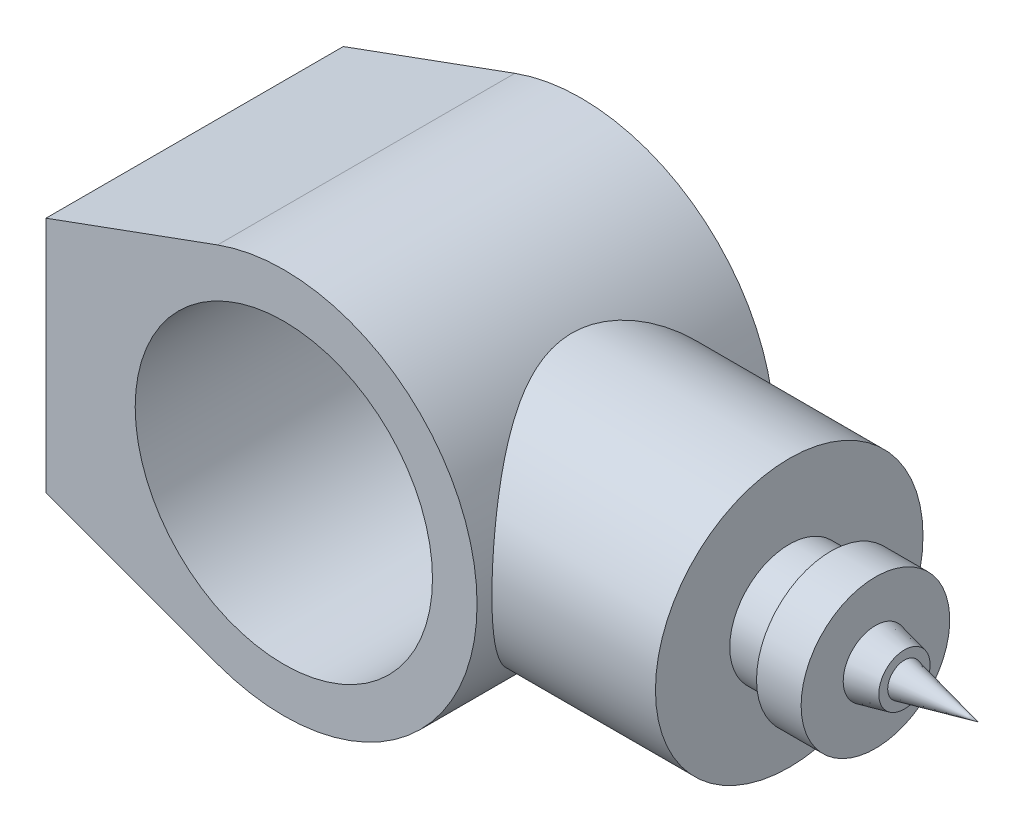
ISO-10303-21;
HEADER;
FILE_DESCRIPTION(('STEP AP214'),'2;1');
FILE_NAME('part.step','',(''),(''),'','','');
FILE_SCHEMA(('AUTOMOTIVE_DESIGN { 1 0 10303 214 1 1 1 1 }'));
ENDSEC;
DATA;
#1=APPLICATION_CONTEXT('core data for automotive mechanical design processes');
#2=APPLICATION_PROTOCOL_DEFINITION('international standard','automotive_design',2000,#1);
#3=PRODUCT_CONTEXT('',#1,'mechanical');
#4=PRODUCT('Part','Part','',(#3));
#5=PRODUCT_RELATED_PRODUCT_CATEGORY('part','',(#4));
#6=PRODUCT_DEFINITION_FORMATION('','',#4);
#7=PRODUCT_DEFINITION_CONTEXT('part definition',#1,'design');
#8=PRODUCT_DEFINITION('design','',#6,#7);
#9=PRODUCT_DEFINITION_SHAPE('','',#8);
#10=(LENGTH_UNIT() NAMED_UNIT(*) SI_UNIT(.MILLI.,.METRE.));
#11=(NAMED_UNIT(*) PLANE_ANGLE_UNIT() SI_UNIT($,.RADIAN.));
#12=(NAMED_UNIT(*) SI_UNIT($,.STERADIAN.) SOLID_ANGLE_UNIT());
#13=UNCERTAINTY_MEASURE_WITH_UNIT(LENGTH_MEASURE(1.E-05),#10,'distance_accuracy_value','');
#14=(GEOMETRIC_REPRESENTATION_CONTEXT(3) GLOBAL_UNCERTAINTY_ASSIGNED_CONTEXT((#13)) GLOBAL_UNIT_ASSIGNED_CONTEXT((#10,
#11,#12)) REPRESENTATION_CONTEXT('',''));
#15=CARTESIAN_POINT('',(0.,0.,0.));
#16=DIRECTION('',(0.,0.,1.));
#17=DIRECTION('',(1.,0.,0.));
#18=AXIS2_PLACEMENT_3D('',#15,#16,#17);
#19=CARTESIAN_POINT('',(0.,0.,50.));
#20=DIRECTION('',(0.,0.,1.));
#21=DIRECTION('',(1.,0.,0.));
#22=AXIS2_PLACEMENT_3D('',#19,#20,#21);
#23=PLANE('',#22);
#24=DIRECTION('',(0.939410286372225,-0.342794856813887,0.));
#25=VECTOR('',#24,1.);
#26=CARTESIAN_POINT('',(-80.,-40.,50.));
#27=LINE('',#26,#25);
#28=CARTESIAN_POINT('',(-80.,-40.,50.));
#29=VERTEX_POINT('',#28);
#30=CARTESIAN_POINT('',(-22.2816656929027,-61.0616686141946,50.));
#31=VERTEX_POINT('',#30);
#32=EDGE_CURVE('E190',#29,#31,#27,.T.);
#33=ORIENTED_EDGE('',*,*,#32,.T.);
#34=CARTESIAN_POINT('',(0.,0.,50.));
#35=DIRECTION('',(0.,0.,1.));
#36=DIRECTION('',(1.,0.,0.));
#37=AXIS2_PLACEMENT_3D('',#34,#35,#36);
#38=CIRCLE('',#37,65.);
#39=CARTESIAN_POINT('',(-22.2816656929027,61.0616686141947,50.));
#40=VERTEX_POINT('',#39);
#41=EDGE_CURVE('E91',#31,#40,#38,.T.);
#42=ORIENTED_EDGE('',*,*,#41,.T.);
#43=DIRECTION('',(-0.939410286372226,-0.342794856813887,0.));
#44=VECTOR('',#43,1.);
#45=CARTESIAN_POINT('',(-80.,40.,50.));
#46=LINE('',#45,#44);
#47=CARTESIAN_POINT('',(-80.,40.,50.));
#48=VERTEX_POINT('',#47);
#49=EDGE_CURVE('E186',#40,#48,#46,.T.);
#50=ORIENTED_EDGE('',*,*,#49,.T.);
#51=DIRECTION('',(0.,-1.,0.));
#52=VECTOR('',#51,1.);
#53=CARTESIAN_POINT('',(-80.,40.,50.));
#54=LINE('',#53,#52);
#55=EDGE_CURVE('E60',#48,#29,#54,.T.);
#56=ORIENTED_EDGE('',*,*,#55,.T.);
#57=EDGE_LOOP('',(#33,#42,#50,#56));
#58=FACE_BOUND('',#57,.T.);
#59=CARTESIAN_POINT('',(0.,0.,50.));
#60=DIRECTION('',(0.,0.,1.));
#61=DIRECTION('',(1.,0.,0.));
#62=AXIS2_PLACEMENT_3D('',#59,#60,#61);
#63=CIRCLE('',#62,50.);
#64=CARTESIAN_POINT('',(50.,0.,50.));
#65=VERTEX_POINT('',#64);
#66=EDGE_CURVE('E200',#65,#65,#63,.T.);
#67=ORIENTED_EDGE('',*,*,#66,.F.);
#68=EDGE_LOOP('',(#67));
#69=FACE_BOUND('',#68,.T.);
#70=ADVANCED_FACE('F43',(#58,#69),#23,.T.);
#71=CARTESIAN_POINT('',(0.,0.,-50.));
#72=DIRECTION('',(0.,0.,1.));
#73=DIRECTION('',(1.,0.,0.));
#74=AXIS2_PLACEMENT_3D('',#71,#72,#73);
#75=PLANE('',#74);
#76=DIRECTION('',(0.939410286372225,-0.342794856813887,0.));
#77=VECTOR('',#76,1.);
#78=CARTESIAN_POINT('',(-80.,-40.,-50.));
#79=LINE('',#78,#77);
#80=CARTESIAN_POINT('',(-80.,-40.,-50.));
#81=VERTEX_POINT('',#80);
#82=CARTESIAN_POINT('',(-22.2816656929027,-61.0616686141946,-50.));
#83=VERTEX_POINT('',#82);
#84=EDGE_CURVE('E184',#81,#83,#79,.T.);
#85=ORIENTED_EDGE('',*,*,#84,.F.);
#86=DIRECTION('',(0.,-1.,0.));
#87=VECTOR('',#86,1.);
#88=CARTESIAN_POINT('',(-80.,40.,-50.));
#89=LINE('',#88,#87);
#90=CARTESIAN_POINT('',(-80.,40.,-50.));
#91=VERTEX_POINT('',#90);
#92=EDGE_CURVE('E84',#91,#81,#89,.T.);
#93=ORIENTED_EDGE('',*,*,#92,.F.);
#94=DIRECTION('',(-0.939410286372226,-0.342794856813887,0.));
#95=VECTOR('',#94,1.);
#96=CARTESIAN_POINT('',(-80.,40.,-50.));
#97=LINE('',#96,#95);
#98=CARTESIAN_POINT('',(-22.2816656929027,61.0616686141947,-50.));
#99=VERTEX_POINT('',#98);
#100=EDGE_CURVE('E78',#99,#91,#97,.T.);
#101=ORIENTED_EDGE('',*,*,#100,.F.);
#102=CARTESIAN_POINT('',(0.,0.,-50.));
#103=DIRECTION('',(0.,0.,1.));
#104=DIRECTION('',(1.,0.,0.));
#105=AXIS2_PLACEMENT_3D('',#102,#103,#104);
#106=CIRCLE('',#105,65.);
#107=EDGE_CURVE('E179',#83,#99,#106,.T.);
#108=ORIENTED_EDGE('',*,*,#107,.F.);
#109=EDGE_LOOP('',(#85,#93,#101,#108));
#110=FACE_BOUND('',#109,.T.);
#111=CARTESIAN_POINT('',(0.,0.,-50.));
#112=DIRECTION('',(0.,0.,1.));
#113=DIRECTION('',(1.,0.,0.));
#114=AXIS2_PLACEMENT_3D('',#111,#112,#113);
#115=CIRCLE('',#114,50.);
#116=CARTESIAN_POINT('',(50.,0.,-50.));
#117=VERTEX_POINT('',#116);
#118=EDGE_CURVE('E202',#117,#117,#115,.T.);
#119=ORIENTED_EDGE('',*,*,#118,.T.);
#120=EDGE_LOOP('',(#119));
#121=FACE_BOUND('',#120,.T.);
#122=ADVANCED_FACE('F158',(#110,#121),#75,.F.);
#123=CARTESIAN_POINT('',(-80.,-40.,50.));
#124=DIRECTION('',(0.342794856813887,0.939410286372225,0.));
#125=DIRECTION('',(-0.939410286372225,0.342794856813887,0.));
#126=AXIS2_PLACEMENT_3D('',#123,#124,#125);
#127=PLANE('',#126);
#128=ORIENTED_EDGE('',*,*,#84,.T.);
#129=DIRECTION('',(0.,0.,-1.));
#130=VECTOR('',#129,1.);
#131=CARTESIAN_POINT('',(-22.2816656929027,-61.0616686141946,50.));
#132=LINE('',#131,#130);
#133=EDGE_CURVE('E11',#31,#83,#132,.T.);
#134=ORIENTED_EDGE('',*,*,#133,.F.);
#135=ORIENTED_EDGE('',*,*,#32,.F.);
#136=DIRECTION('',(0.,0.,-1.));
#137=VECTOR('',#136,1.);
#138=CARTESIAN_POINT('',(-80.,-40.,50.));
#139=LINE('',#138,#137);
#140=EDGE_CURVE('E194',#29,#81,#139,.T.);
#141=ORIENTED_EDGE('',*,*,#140,.T.);
#142=EDGE_LOOP('',(#128,#134,#135,#141));
#143=FACE_BOUND('',#142,.T.);
#144=ADVANCED_FACE('F45',(#143),#127,.F.);
#145=CARTESIAN_POINT('',(0.,0.,50.));
#146=DIRECTION('',(0.,0.,-1.));
#147=DIRECTION('',(-1.,0.,0.));
#148=AXIS2_PLACEMENT_3D('',#145,#146,#147);
#149=CYLINDRICAL_SURFACE('',#148,65.);
#150=CARTESIAN_POINT('',(65.,0.,-45.));
#151=CARTESIAN_POINT('',(65.0000011696057,1.12147330120565,-45.0000012025283));
#152=CARTESIAN_POINT('',(64.9709159765212,2.24292945230778,-44.9580201602482));
#153=CARTESIAN_POINT('',(64.8553068641383,4.47658414079082,-44.7907856093689));
#154=CARTESIAN_POINT('',(64.7687842573088,5.58878288911931,-44.6655340035371));
#155=CARTESIAN_POINT('',(64.5403785763002,7.79555151848627,-44.3336771879691));
#156=CARTESIAN_POINT('',(64.3984760503456,8.8901150644775,-44.1270433931238));
#157=CARTESIAN_POINT('',(64.0626457436966,11.0533096019768,-43.6354760134034));
#158=CARTESIAN_POINT('',(63.8687169569864,12.1219400915896,-43.3505409144375));
#159=CARTESIAN_POINT('',(63.4342222744662,14.2212125160505,-42.7078017297046));
#160=CARTESIAN_POINT('',(63.1938918545645,15.2520162370063,-42.3503651251477));
#161=CARTESIAN_POINT('',(62.6709259446924,17.2756280115286,-41.5659763086892));
#162=CARTESIAN_POINT('',(62.3882907364915,18.2684363181069,-41.1390245597888));
#163=CARTESIAN_POINT('',(61.786108553932,20.2116697228795,-40.2199419970838));
#164=CARTESIAN_POINT('',(61.4665619062631,21.1620951960855,-39.7278117601444));
#165=CARTESIAN_POINT('',(60.7962171584065,23.0172309124314,-38.6825647509799));
#166=CARTESIAN_POINT('',(60.4454175300334,23.9219389167185,-38.1294449962195));
#167=CARTESIAN_POINT('',(59.6865648974474,25.7601880140228,-36.9151737617935));
#168=CARTESIAN_POINT('',(59.27618815402,26.6893215363403,-36.2488040005491));
#169=CARTESIAN_POINT('',(58.4330275057249,28.4880338622967,-34.8529502059224));
#170=CARTESIAN_POINT('',(58.0002425478181,29.3576098626539,-34.1234632053608));
#171=CARTESIAN_POINT('',(57.1195111836478,31.0364486388512,-32.6040251352403));
#172=CARTESIAN_POINT('',(56.6715447181891,31.8456267033451,-31.8139921794123));
#173=CARTESIAN_POINT('',(55.7691986061138,33.4006700551814,-30.1773036556993));
#174=CARTESIAN_POINT('',(55.3148185876119,34.1465316534289,-29.3306447936721));
#175=CARTESIAN_POINT('',(54.3303114345595,35.6959084068904,-27.4326466159468));
#176=CARTESIAN_POINT('',(53.8005937511269,36.4872853280241,-26.3711450656527));
#177=CARTESIAN_POINT('',(52.7593327891933,37.977350950991,-24.17604025639));
#178=CARTESIAN_POINT('',(52.2477941160227,38.6760162868262,-23.0424189272517));
#179=CARTESIAN_POINT('',(51.2608149265043,39.9749077721744,-20.7072341856928));
#180=CARTESIAN_POINT('',(50.7853275075273,40.5752630453964,-19.5057627267967));
#181=CARTESIAN_POINT('',(49.8892399163793,41.6721166930025,-17.036931864064));
#182=CARTESIAN_POINT('',(49.4686114171659,42.1686687478853,-15.7696069409943));
#183=CARTESIAN_POINT('',(48.8208029416879,42.9149535309564,-13.5723996352816));
#184=CARTESIAN_POINT('',(48.5738420263558,43.1936925213245,-12.6581208440976));
#185=CARTESIAN_POINT('',(48.1238801744123,43.6944569649788,-10.8035389223551));
#186=CARTESIAN_POINT('',(47.9208721021929,43.9164916250901,-9.86324004407419));
#187=CARTESIAN_POINT('',(47.5660754926548,44.3005296261304,-7.96250438663408));
#188=CARTESIAN_POINT('',(47.4142038087044,44.4626304606427,-7.00210302149487));
#189=CARTESIAN_POINT('',(47.1671263845177,44.7246555122386,-5.06554052628517));
#190=CARTESIAN_POINT('',(47.071920625953,44.824579749433,-4.08937940131224));
#191=CARTESIAN_POINT('',(46.9418899090943,44.9607388198673,-2.12323648479671));
#192=CARTESIAN_POINT('',(46.9073939345417,44.9966266570423,-1.13320851844658));
#193=CARTESIAN_POINT('',(46.9013571135476,45.0029190462421,0.847248377093846));
#194=CARTESIAN_POINT('',(46.9298161498631,44.9733237202183,1.83767730553399));
#195=CARTESIAN_POINT('',(47.0484302849821,44.8492190899201,3.81128752429081));
#196=CARTESIAN_POINT('',(47.1386230552101,44.7546701492421,4.79446401850661));
#197=CARTESIAN_POINT('',(47.3768313176079,44.5024241630868,6.74551496467456));
#198=CARTESIAN_POINT('',(47.5248480621437,44.3447257499009,7.71338908473168));
#199=CARTESIAN_POINT('',(47.8621764271841,43.9803320764262,9.56919366964685));
#200=CARTESIAN_POINT('',(48.0484149088864,43.7772163066585,10.4583970625519));
#201=CARTESIAN_POINT('',(48.4609441046406,43.3201064011899,12.2144143492181));
#202=CARTESIAN_POINT('',(48.6872496045115,43.0660934784814,13.0812198417583));
#203=CARTESIAN_POINT('',(49.1738509640383,42.5096331932464,14.7898225666927));
#204=CARTESIAN_POINT('',(49.4341648638834,42.2071601049958,15.6316062329481));
#205=CARTESIAN_POINT('',(49.9825182796335,41.5563350032134,17.2876417419013));
#206=CARTESIAN_POINT('',(50.2705534011697,41.2079902580444,18.1018979206949));
#207=CARTESIAN_POINT('',(51.0225431471345,40.2767822129268,20.1137766396802));
#208=CARTESIAN_POINT('',(51.5007434523329,39.6654891440572,21.2930273345177));
#209=CARTESIAN_POINT('',(52.4891158781477,38.348029920852,23.5833678403921));
#210=CARTESIAN_POINT('',(52.9993005340589,37.6418264436726,24.6944305853524));
#211=CARTESIAN_POINT('',(54.0361557973494,36.1376496350166,26.8476775780095));
#212=CARTESIAN_POINT('',(54.5628535785461,35.3395185623559,27.8897384505711));
#213=CARTESIAN_POINT('',(55.6171804467178,33.6558443419671,29.8998791095632));
#214=CARTESIAN_POINT('',(56.1448094104418,32.7703120184234,30.8679680307498));
#215=CARTESIAN_POINT('',(57.1932449701135,30.9045304086319,32.7363921475659));
#216=CARTESIAN_POINT('',(57.7139191350983,29.9233731295192,33.6358963165067));
#217=CARTESIAN_POINT('',(58.7296419536465,27.8771206485979,35.3503553497921));
#218=CARTESIAN_POINT('',(59.2246882700661,26.8120178135979,36.1653025097018));
#219=CARTESIAN_POINT('',(60.1756566955639,24.603520952242,37.7024332048813));
#220=CARTESIAN_POINT('',(60.6316475651595,23.4602711709794,38.4247809320632));
#221=CARTESIAN_POINT('',(61.4931891608211,21.0989507187335,39.7703323765769));
#222=CARTESIAN_POINT('',(61.898755017873,19.8809026570888,40.3935658507715));
#223=CARTESIAN_POINT('',(62.5646802947783,17.6549035875762,41.4059204565395));
#224=CARTESIAN_POINT('',(62.8372982548467,16.6602403417733,41.8163120535009));
#225=CARTESIAN_POINT('',(63.3397164077328,14.6345031625144,42.5675669112335));
#226=CARTESIAN_POINT('',(63.569522535998,13.603434299959,42.9084398107234));
#227=CARTESIAN_POINT('',(63.9815049902596,11.5110112910016,43.5164676119118));
#228=CARTESIAN_POINT('',(64.1637052650743,10.4496726714621,43.7836595836378));
#229=CARTESIAN_POINT('',(64.476639865795,8.3029699318337,44.2409869387356));
#230=CARTESIAN_POINT('',(64.6073730982257,7.21760530180253,44.431120684921));
#231=CARTESIAN_POINT('',(64.8147345736682,5.02649787175021,44.7321113931982));
#232=CARTESIAN_POINT('',(64.8911534961694,3.9206929048976,44.8426616714377));
#233=CARTESIAN_POINT('',(64.9872183357685,1.70145350776205,44.9815637341559));
#234=CARTESIAN_POINT('',(65.0068642771874,0.588019080747661,45.0099155538474));
#235=CARTESIAN_POINT('',(64.9889001241945,-1.63741781931569,44.9839662509348));
#236=CARTESIAN_POINT('',(64.9512898349751,-2.7494202874797,44.929664847113));
#237=CARTESIAN_POINT('',(64.819734418053,-4.96298947367604,44.7392747901951));
#238=CARTESIAN_POINT('',(64.7257910494465,-6.06455651648128,44.6031886909653));
#239=CARTESIAN_POINT('',(64.491175703309,-8.18254449212149,44.2620157992034));
#240=CARTESIAN_POINT('',(64.3536808680178,-9.20007959997774,44.0616107864454));
#241=CARTESIAN_POINT('',(64.0337856060908,-11.2121337136589,43.5930613516679));
#242=CARTESIAN_POINT('',(63.8513873855499,-12.2066538475799,43.3249202574929));
#243=CARTESIAN_POINT('',(63.4451725249075,-14.1673074608523,42.7239854011605));
#244=CARTESIAN_POINT('',(63.2213525684632,-15.1334386601222,42.3911864622047));
#245=CARTESIAN_POINT('',(62.736336352677,-17.0327019487273,41.6643868113868));
#246=CARTESIAN_POINT('',(62.4751380044848,-17.965832190203,41.2703826790342));
#247=CARTESIAN_POINT('',(61.8990085085122,-19.8637431772395,40.3931275129008));
#248=CARTESIAN_POINT('',(61.5815209528501,-20.8256806929253,39.9054081529013));
#249=CARTESIAN_POINT('',(60.9142086391395,-22.7035764997345,38.8677076181211));
#250=CARTESIAN_POINT('',(60.5643826081083,-23.6195329786528,38.3177239921568));
#251=CARTESIAN_POINT('',(59.8381347129401,-25.4032558353403,37.1592008079418));
#252=CARTESIAN_POINT('',(59.4616987975441,-26.270996314329,36.5506302507532));
#253=CARTESIAN_POINT('',(58.6884577670336,-27.9557544991496,35.2787474176624));
#254=CARTESIAN_POINT('',(58.2916515549571,-28.7727694681138,34.6154321925309));
#255=CARTESIAN_POINT('',(57.4151711853793,-30.4889708749912,33.1199200847161));
#256=CARTESIAN_POINT('',(56.9328754552547,-31.3785212006928,32.2781812569548));
#257=CARTESIAN_POINT('',(55.9590893109094,-33.083904221517,30.5278352445589));
#258=CARTESIAN_POINT('',(55.4675975421249,-33.8997259516808,29.6192181500899));
#259=CARTESIAN_POINT('',(54.4860350387396,-35.45586994741,27.7375714933992));
#260=CARTESIAN_POINT('',(53.9959654596117,-36.1961418986443,26.7644997080006));
#261=CARTESIAN_POINT('',(53.0294834997435,-37.5978502361012,24.7568233036381));
#262=CARTESIAN_POINT('',(52.553069328415,-38.2592969946585,23.7222268074148));
#263=CARTESIAN_POINT('',(51.679941347726,-39.4291013564639,21.7149007388746));
#264=CARTESIAN_POINT('',(51.2803372484816,-39.9463152685162,20.7485884228094));
#265=CARTESIAN_POINT('',(50.5123974548912,-40.9130636661729,18.7705314851885));
#266=CARTESIAN_POINT('',(50.1440619804653,-41.3625976757847,17.7587865441704));
#267=CARTESIAN_POINT('',(49.4504928922364,-42.1893301292689,15.693797265063));
#268=CARTESIAN_POINT('',(49.1251906412473,-42.566644202947,14.6406225749502));
#269=CARTESIAN_POINT('',(48.5290098021012,-43.2451098617227,12.4950157035288));
#270=CARTESIAN_POINT('',(48.2581179989952,-43.5462799449171,11.4025931307277));
#271=CARTESIAN_POINT('',(47.8271610412375,-44.018687486118,9.3921629994351));
#272=CARTESIAN_POINT('',(47.6558419905218,-44.2036946073207,8.47979353570418));
#273=CARTESIAN_POINT('',(47.3627606953031,-44.517583244497,6.63757582668244));
#274=CARTESIAN_POINT('',(47.2409923142224,-44.6464717105955,5.70772976070372));
#275=CARTESIAN_POINT('',(47.05166615705,-44.8459556683364,3.83718735816971));
#276=CARTESIAN_POINT('',(46.9840561376509,-44.9166073394187,2.89650236820513));
#277=CARTESIAN_POINT('',(46.9055698265682,-44.9985645522097,1.01014116515034));
#278=CARTESIAN_POINT('',(46.8946943314281,-45.0098692606967,0.0644648821697781));
#279=CARTESIAN_POINT('',(46.9301408777119,-44.972908524549,-1.82506201386805));
#280=CARTESIAN_POINT('',(46.9764888551696,-44.9246160680299,-2.76891160474202));
#281=CARTESIAN_POINT('',(47.1245232303033,-44.7693052695385,-4.64731891289863));
#282=CARTESIAN_POINT('',(47.226209296244,-44.6622872796082,-5.58187668584875));
#283=CARTESIAN_POINT('',(47.4811423262629,-44.3911660407895,-7.43666598606562));
#284=CARTESIAN_POINT('',(47.634452919394,-44.2269923369625,-8.35687836049679));
#285=CARTESIAN_POINT('',(47.9871889035598,-43.8440109221367,-10.1768310643423));
#286=CARTESIAN_POINT('',(48.1866204648689,-43.6251959006593,-11.0765686368372));
#287=CARTESIAN_POINT('',(48.6908782922366,-43.0625185245671,-13.116726178063));
#288=CARTESIAN_POINT('',(49.0093972350599,-42.7008255731353,-14.2488681052183));
#289=CARTESIAN_POINT('',(49.699554494161,-41.8955268796886,-16.4668795226373));
#290=CARTESIAN_POINT('',(50.0712093704162,-41.4518955887103,-17.5527344499461));
#291=CARTESIAN_POINT('',(50.8544123719762,-40.4872212981013,-19.6760329984318));
#292=CARTESIAN_POINT('',(51.2660067549033,-39.9660881554129,-20.7134183727638));
#293=CARTESIAN_POINT('',(52.116211879306,-38.8508952329155,-22.7363587217865));
#294=CARTESIAN_POINT('',(52.5548209260535,-38.2568400254561,-23.7219169406072));
#295=CARTESIAN_POINT('',(53.4579357785502,-36.9847423381263,-25.6613286822633));
#296=CARTESIAN_POINT('',(53.9228021101372,-36.305111863905,-26.6139712103077));
#297=CARTESIAN_POINT('',(54.8583333343946,-34.8753950985048,-28.4617532840731));
#298=CARTESIAN_POINT('',(55.3289982185488,-34.1253089107936,-29.3568929142368));
#299=CARTESIAN_POINT('',(56.2664339133503,-32.5564691651912,-31.0876310121466));
#300=CARTESIAN_POINT('',(56.733203509343,-31.7376950080829,-31.923211478402));
#301=CARTESIAN_POINT('',(57.6535165855435,-30.033481652025,-33.5315189390535));
#302=CARTESIAN_POINT('',(58.1070588196762,-29.1480362003111,-34.3042400240121));
#303=CARTESIAN_POINT('',(59.0635284336244,-27.1643113596245,-35.9022819462667));
#304=CARTESIAN_POINT('',(59.5626106290919,-26.0547472869609,-36.7159606163356));
#305=CARTESIAN_POINT('',(60.5176757229357,-23.7521280348397,-38.2458641369291));
#306=CARTESIAN_POINT('',(60.9736519283074,-22.5590599397197,-38.962073861155));
#307=CARTESIAN_POINT('',(61.6149926579414,-20.712734812731,-39.9558623322098));
#308=CARTESIAN_POINT('',(61.8215919655179,-20.088110583999,-40.2735888165198));
#309=CARTESIAN_POINT('',(62.2191547005857,-18.8206694867556,-40.8812436548858));
#310=CARTESIAN_POINT('',(62.4101203779566,-18.1778552539996,-41.1711760099034));
#311=CARTESIAN_POINT('',(62.7748527233683,-16.8752831176649,-41.7219931318356));
#312=CARTESIAN_POINT('',(62.9486230408552,-16.2155288469421,-41.9828840638124));
#313=CARTESIAN_POINT('',(63.2775356475737,-14.8804011558233,-42.4744610119283));
#314=CARTESIAN_POINT('',(63.432679284421,-14.2050288695917,-42.7051492133046));
#315=CARTESIAN_POINT('',(63.8070721968101,-12.4447010544915,-43.25974494481));
#316=CARTESIAN_POINT('',(64.0114184468014,-11.3490405228654,-43.5602757498286));
#317=CARTESIAN_POINT('',(64.3654191982087,-9.12991345978799,-44.078827644396));
#318=CARTESIAN_POINT('',(64.5150820049425,-8.00645117856253,-44.2968612637911));
#319=CARTESIAN_POINT('',(64.7559993187061,-5.7408225372911,-44.6470112993715));
#320=CARTESIAN_POINT('',(64.847297757104,-4.59867091062171,-44.7791923387442));
#321=CARTESIAN_POINT('',(64.9692976296881,-2.30434018473195,-44.9556862638234));
#322=CARTESIAN_POINT('',(64.9999987983895,-1.15216104160189,-44.999998764566));
#323=CARTESIAN_POINT('',(65.,0.,-45.));
#324=B_SPLINE_CURVE_WITH_KNOTS('',3,(#150,#151,#152,#153,#154,#155,#156,#157,#158,#159,#160,
#161,#162,#163,#164,#165,#166,#167,#168,#169,#170,#171,#172,#173,#174,#175,#176,#177,#178,#179,
#180,#181,#182,#183,#184,#185,#186,#187,#188,#189,#190,#191,#192,#193,#194,#195,#196,#197,#198,
#199,#200,#201,#202,#203,#204,#205,#206,#207,#208,#209,#210,#211,#212,#213,#214,#215,#216,#217,
#218,#219,#220,#221,#222,#223,#224,#225,#226,#227,#228,#229,#230,#231,#232,#233,#234,#235,#236,
#237,#238,#239,#240,#241,#242,#243,#244,#245,#246,#247,#248,#249,#250,#251,#252,#253,#254,#255,
#256,#257,#258,#259,#260,#261,#262,#263,#264,#265,#266,#267,#268,#269,#270,#271,#272,#273,#274,
#275,#276,#277,#278,#279,#280,#281,#282,#283,#284,#285,#286,#287,#288,#289,#290,#291,#292,#293,
#294,#295,#296,#297,#298,#299,#300,#301,#302,#303,#304,#305,#306,#307,#308,#309,#310,#311,#312,
#313,#314,#315,#316,#317,#318,#319,#320,#321,#322,#323),.UNSPECIFIED.,.T.,.F.,(4,2,2,2,2,2,2,2,
2,2,2,2,2,2,2,2,2,2,2,2,2,2,2,2,2,2,2,2,2,2,2,2,2,2,2,2,2,2,2,2,2,2,2,2,2,2,2,2,2,2,2,2,2,2,2,2,
2,2,2,2,2,2,2,2,2,2,2,2,2,2,2,2,2,2,2,2,2,2,2,2,2,2,2,2,2,2,4),(0.,3.36323892794144,
6.72640100710136,10.0907454360665,13.4551549250109,16.8029195613731,20.1506619010729,
23.4983746134034,26.8462511096753,30.4871649037346,34.1282499524345,37.7743494260164,
41.4206611917408,45.6939383064405,49.9682903731881,54.2369825353392,58.5034617073671,
61.4625138492405,64.4210852373372,67.3748225577202,70.3285589227264,73.2982527376573,
76.2679410220408,79.2394430998938,82.2110095388412,85.0011411726389,87.7923045951579,
90.584954683776,93.3771628083065,97.6064034875676,101.837312178738,106.075592113262,
110.313347816192,114.596218662803,118.879479402292,123.155037051935,127.429308626693,
130.755998382163,134.082226580387,137.406778235214,140.731400520075,144.068767009318,
147.406132068879,150.743508483461,154.080780688207,157.215791533369,160.350648386749,
163.485756334407,166.621039552604,169.990545063149,173.360183268584,176.73161428665,
180.103227050672,184.047902440152,187.993163521895,191.94103513809,195.888386692538,
199.385185586645,202.88200907258,206.373186157811,209.863514294626,212.700365177753,
215.536864625513,218.370624567028,221.204424293963,224.039508887241,226.874576485218,
229.713151272815,232.55210603787,236.23803941247,239.925124033801,243.616531168718,
247.307706963636,251.081871120678,254.856029735251,258.631324277359,262.406973327354,
266.792058434818,271.177823293658,273.368885604935,275.55963203795,277.749912517597,
279.940034437727,283.398420446896,286.856280978073,290.31153567335,293.766805506531),.UNSPECIFIED.);
#325=CARTESIAN_POINT('',(65.,0.,-45.));
#326=VERTEX_POINT('',#325);
#327=EDGE_CURVE('E124',#326,#326,#324,.T.);
#328=ORIENTED_EDGE('',*,*,#327,.F.);
#329=EDGE_LOOP('',(#328));
#330=FACE_BOUND('',#329,.T.);
#331=ORIENTED_EDGE('',*,*,#107,.T.);
#332=DIRECTION('',(0.,0.,-1.));
#333=VECTOR('',#332,1.);
#334=CARTESIAN_POINT('',(-22.2816656929027,61.0616686141947,50.));
#335=LINE('',#334,#333);
#336=EDGE_CURVE('E52',#40,#99,#335,.T.);
#337=ORIENTED_EDGE('',*,*,#336,.F.);
#338=ORIENTED_EDGE('',*,*,#41,.F.);
#339=ORIENTED_EDGE('',*,*,#133,.T.);
#340=EDGE_LOOP('',(#331,#337,#338,#339));
#341=FACE_BOUND('',#340,.T.);
#342=ADVANCED_FACE('F171',(#330,#341),#149,.T.);
#343=CARTESIAN_POINT('',(-80.,40.,50.));
#344=DIRECTION('',(0.342794856813887,-0.939410286372225,0.));
#345=DIRECTION('',(0.939410286372225,0.342794856813887,0.));
#346=AXIS2_PLACEMENT_3D('',#343,#344,#345);
#347=PLANE('',#346);
#348=ORIENTED_EDGE('',*,*,#100,.T.);
#349=DIRECTION('',(0.,0.,-1.));
#350=VECTOR('',#349,1.);
#351=CARTESIAN_POINT('',(-80.,40.,50.));
#352=LINE('',#351,#350);
#353=EDGE_CURVE('E187',#48,#91,#352,.T.);
#354=ORIENTED_EDGE('',*,*,#353,.F.);
#355=ORIENTED_EDGE('',*,*,#49,.F.);
#356=ORIENTED_EDGE('',*,*,#336,.T.);
#357=EDGE_LOOP('',(#348,#354,#355,#356));
#358=FACE_BOUND('',#357,.T.);
#359=ADVANCED_FACE('F169',(#358),#347,.F.);
#360=CARTESIAN_POINT('',(-80.,40.,50.));
#361=DIRECTION('',(1.,0.,0.));
#362=DIRECTION('',(0.,1.,0.));
#363=AXIS2_PLACEMENT_3D('',#360,#361,#362);
#364=PLANE('',#363);
#365=ORIENTED_EDGE('',*,*,#92,.T.);
#366=ORIENTED_EDGE('',*,*,#140,.F.);
#367=ORIENTED_EDGE('',*,*,#55,.F.);
#368=ORIENTED_EDGE('',*,*,#353,.T.);
#369=EDGE_LOOP('',(#365,#366,#367,#368));
#370=FACE_BOUND('',#369,.T.);
#371=ADVANCED_FACE('F155',(#370),#364,.F.);
#372=CARTESIAN_POINT('',(0.,0.,50.));
#373=DIRECTION('',(0.,0.,-1.));
#374=DIRECTION('',(-1.,0.,0.));
#375=AXIS2_PLACEMENT_3D('',#372,#373,#374);
#376=CYLINDRICAL_SURFACE('',#375,50.);
#377=ORIENTED_EDGE('',*,*,#66,.T.);
#378=EDGE_LOOP('',(#377));
#379=FACE_BOUND('',#378,.T.);
#380=ORIENTED_EDGE('',*,*,#118,.F.);
#381=EDGE_LOOP('',(#380));
#382=FACE_BOUND('',#381,.T.);
#383=ADVANCED_FACE('F145',(#379,#382),#376,.F.);
#384=CARTESIAN_POINT('',(-80.002,0.,0.));
#385=DIRECTION('',(1.,0.,0.));
#386=DIRECTION('',(0.,0.,-1.));
#387=AXIS2_PLACEMENT_3D('',#384,#385,#386);
#388=CYLINDRICAL_SURFACE('',#387,45.);
#389=CARTESIAN_POINT('',(120.,0.,0.));
#390=DIRECTION('',(1.,0.,0.));
#391=DIRECTION('',(0.,0.,-1.));
#392=AXIS2_PLACEMENT_3D('',#389,#390,#391);
#393=CIRCLE('',#392,45.);
#394=CARTESIAN_POINT('',(120.,0.,-45.));
#395=VERTEX_POINT('',#394);
#396=EDGE_CURVE('E132',#395,#395,#393,.T.);
#397=ORIENTED_EDGE('',*,*,#396,.F.);
#398=EDGE_LOOP('',(#397));
#399=FACE_BOUND('',#398,.T.);
#400=ORIENTED_EDGE('',*,*,#327,.T.);
#401=EDGE_LOOP('',(#400));
#402=FACE_BOUND('',#401,.T.);
#403=ADVANCED_FACE('F134',(#399,#402),#388,.T.);
#404=CARTESIAN_POINT('',(120.,0.,0.));
#405=DIRECTION('',(1.,0.,0.));
#406=DIRECTION('',(0.,0.,-1.));
#407=AXIS2_PLACEMENT_3D('',#404,#405,#406);
#408=PLANE('',#407);
#409=CARTESIAN_POINT('',(120.,0.,0.));
#410=DIRECTION('',(-1.,0.,0.));
#411=DIRECTION('',(0.,0.,1.));
#412=AXIS2_PLACEMENT_3D('',#409,#410,#411);
#413=CIRCLE('',#412,20.);
#414=CARTESIAN_POINT('',(120.,0.,20.));
#415=VERTEX_POINT('',#414);
#416=EDGE_CURVE('E121',#415,#415,#413,.T.);
#417=ORIENTED_EDGE('',*,*,#416,.T.);
#418=EDGE_LOOP('',(#417));
#419=FACE_BOUND('',#418,.T.);
#420=ORIENTED_EDGE('',*,*,#396,.T.);
#421=EDGE_LOOP('',(#420));
#422=FACE_BOUND('',#421,.T.);
#423=ADVANCED_FACE('F142',(#419,#422),#408,.T.);
#424=CARTESIAN_POINT('',(0.,0.,0.));
#425=DIRECTION('',(-1.,0.,0.));
#426=DIRECTION('',(0.,0.,1.));
#427=AXIS2_PLACEMENT_3D('',#424,#425,#426);
#428=CYLINDRICAL_SURFACE('',#427,20.);
#429=CARTESIAN_POINT('',(134.,0.,0.));
#430=DIRECTION('',(-1.,0.,0.));
#431=DIRECTION('',(0.,0.,1.));
#432=AXIS2_PLACEMENT_3D('',#429,#430,#431);
#433=CIRCLE('',#432,20.);
#434=CARTESIAN_POINT('',(134.,0.,20.));
#435=VERTEX_POINT('',#434);
#436=EDGE_CURVE('E118',#435,#435,#433,.T.);
#437=ORIENTED_EDGE('',*,*,#436,.T.);
#438=EDGE_LOOP('',(#437));
#439=FACE_BOUND('',#438,.T.);
#440=ORIENTED_EDGE('',*,*,#416,.F.);
#441=EDGE_LOOP('',(#440));
#442=FACE_BOUND('',#441,.T.);
#443=ADVANCED_FACE('F140',(#439,#442),#428,.T.);
#444=CARTESIAN_POINT('',(134.,-20.,0.));
#445=DIRECTION('',(-1.,0.,0.));
#446=DIRECTION('',(0.,0.,1.));
#447=AXIS2_PLACEMENT_3D('',#444,#445,#446);
#448=PLANE('',#447);
#449=CARTESIAN_POINT('',(134.,0.,0.));
#450=DIRECTION('',(-1.,0.,0.));
#451=DIRECTION('',(0.,0.,1.));
#452=AXIS2_PLACEMENT_3D('',#449,#450,#451);
#453=CIRCLE('',#452,25.);
#454=CARTESIAN_POINT('',(134.,0.,25.));
#455=VERTEX_POINT('',#454);
#456=EDGE_CURVE('E115',#455,#455,#453,.T.);
#457=ORIENTED_EDGE('',*,*,#456,.T.);
#458=EDGE_LOOP('',(#457));
#459=FACE_BOUND('',#458,.T.);
#460=ORIENTED_EDGE('',*,*,#436,.F.);
#461=EDGE_LOOP('',(#460));
#462=FACE_BOUND('',#461,.T.);
#463=ADVANCED_FACE('F150',(#459,#462),#448,.T.);
#464=CARTESIAN_POINT('',(0.,0.,0.));
#465=DIRECTION('',(-1.,0.,0.));
#466=DIRECTION('',(0.,0.,1.));
#467=AXIS2_PLACEMENT_3D('',#464,#465,#466);
#468=CYLINDRICAL_SURFACE('',#467,25.);
#469=CARTESIAN_POINT('',(149.,0.,0.));
#470=DIRECTION('',(-1.,0.,0.));
#471=DIRECTION('',(0.,0.,1.));
#472=AXIS2_PLACEMENT_3D('',#469,#470,#471);
#473=CIRCLE('',#472,25.);
#474=CARTESIAN_POINT('',(149.,0.,25.));
#475=VERTEX_POINT('',#474);
#476=EDGE_CURVE('E112',#475,#475,#473,.T.);
#477=ORIENTED_EDGE('',*,*,#476,.T.);
#478=EDGE_LOOP('',(#477));
#479=FACE_BOUND('',#478,.T.);
#480=ORIENTED_EDGE('',*,*,#456,.F.);
#481=EDGE_LOOP('',(#480));
#482=FACE_BOUND('',#481,.T.);
#483=ADVANCED_FACE('F300',(#479,#482),#468,.T.);
#484=CARTESIAN_POINT('',(149.,-25.,0.));
#485=DIRECTION('',(1.,0.,0.));
#486=DIRECTION('',(0.,0.,-1.));
#487=AXIS2_PLACEMENT_3D('',#484,#485,#486);
#488=PLANE('',#487);
#489=CARTESIAN_POINT('',(149.,0.,0.));
#490=DIRECTION('',(-1.,0.,0.));
#491=DIRECTION('',(0.,0.,1.));
#492=AXIS2_PLACEMENT_3D('',#489,#490,#491);
#493=CIRCLE('',#492,10.8455383296237);
#494=CARTESIAN_POINT('',(149.,0.,10.8455383296237));
#495=VERTEX_POINT('',#494);
#496=EDGE_CURVE('E107',#495,#495,#493,.T.);
#497=ORIENTED_EDGE('',*,*,#496,.T.);
#498=EDGE_LOOP('',(#497));
#499=FACE_BOUND('',#498,.T.);
#500=ORIENTED_EDGE('',*,*,#476,.F.);
#501=EDGE_LOOP('',(#500));
#502=FACE_BOUND('',#501,.T.);
#503=ADVANCED_FACE('F311',(#499,#502),#488,.T.);
#504=CARTESIAN_POINT('',(149.,0.,0.));
#505=DIRECTION('',(-1.,0.,0.));
#506=DIRECTION('',(0.,0.,1.));
#507=AXIS2_PLACEMENT_3D('',#504,#505,#506);
#508=CONICAL_SURFACE('',#507,10.8455383296237,0.223612663971063);
#509=CARTESIAN_POINT('',(158.751026923706,0.,0.));
#510=DIRECTION('',(-1.,0.,0.));
#511=DIRECTION('',(0.,0.,1.));
#512=AXIS2_PLACEMENT_3D('',#509,#510,#511);
#513=CIRCLE('',#512,8.62800052088853);
#514=CARTESIAN_POINT('',(158.751026923706,0.,8.62800052088853));
#515=VERTEX_POINT('',#514);
#516=EDGE_CURVE('E104',#515,#515,#513,.T.);
#517=ORIENTED_EDGE('',*,*,#516,.T.);
#518=EDGE_LOOP('',(#517));
#519=FACE_BOUND('',#518,.T.);
#520=ORIENTED_EDGE('',*,*,#496,.F.);
#521=EDGE_LOOP('',(#520));
#522=FACE_BOUND('',#521,.T.);
#523=ADVANCED_FACE('F323',(#519,#522),#508,.T.);
#524=CARTESIAN_POINT('',(158.751026923706,-8.62800052088853,0.));
#525=DIRECTION('',(1.,0.,0.));
#526=DIRECTION('',(0.,0.,-1.));
#527=AXIS2_PLACEMENT_3D('',#524,#525,#526);
#528=PLANE('',#527);
#529=CARTESIAN_POINT('',(158.751026923706,0.,0.));
#530=DIRECTION('',(-1.,0.,0.));
#531=DIRECTION('',(0.,0.,1.));
#532=AXIS2_PLACEMENT_3D('',#529,#530,#531);
#533=CIRCLE('',#532,5.62800052088853);
#534=CARTESIAN_POINT('',(158.751026923706,0.,5.62800052088853));
#535=VERTEX_POINT('',#534);
#536=EDGE_CURVE('E102',#535,#535,#533,.T.);
#537=ORIENTED_EDGE('',*,*,#536,.T.);
#538=EDGE_LOOP('',(#537));
#539=FACE_BOUND('',#538,.T.);
#540=ORIENTED_EDGE('',*,*,#516,.F.);
#541=EDGE_LOOP('',(#540));
#542=FACE_BOUND('',#541,.T.);
#543=ADVANCED_FACE('F98',(#539,#542),#528,.T.);
#544=CARTESIAN_POINT('',(158.751026923706,0.,0.));
#545=DIRECTION('',(-1.,0.,0.));
#546=DIRECTION('',(0.,0.,1.));
#547=AXIS2_PLACEMENT_3D('',#544,#545,#546);
#548=CONICAL_SURFACE('',#547,5.62800052088853,0.223612663971063);
#549=CARTESIAN_POINT('',(183.498647636028,0.,0.));
#550=VERTEX_POINT('',#549);
#551=VERTEX_LOOP('',#550);
#552=FACE_BOUND('',#551,.T.);
#553=ORIENTED_EDGE('',*,*,#536,.F.);
#554=EDGE_LOOP('',(#553));
#555=FACE_BOUND('',#554,.T.);
#556=ADVANCED_FACE('F95',(#552,#555),#548,.T.);
#557=CLOSED_SHELL('',(#70,#122,#144,#342,#359,#371,#383,#403,#423,#443,#463,#483,#503,#523,#543,#556));
#558=MANIFOLD_SOLID_BREP('B2',#557);
#559=ADVANCED_BREP_SHAPE_REPRESENTATION('',(#18,#558),#14);
#560=SHAPE_DEFINITION_REPRESENTATION(#9,#559);
ENDSEC;
END-ISO-10303-21;
